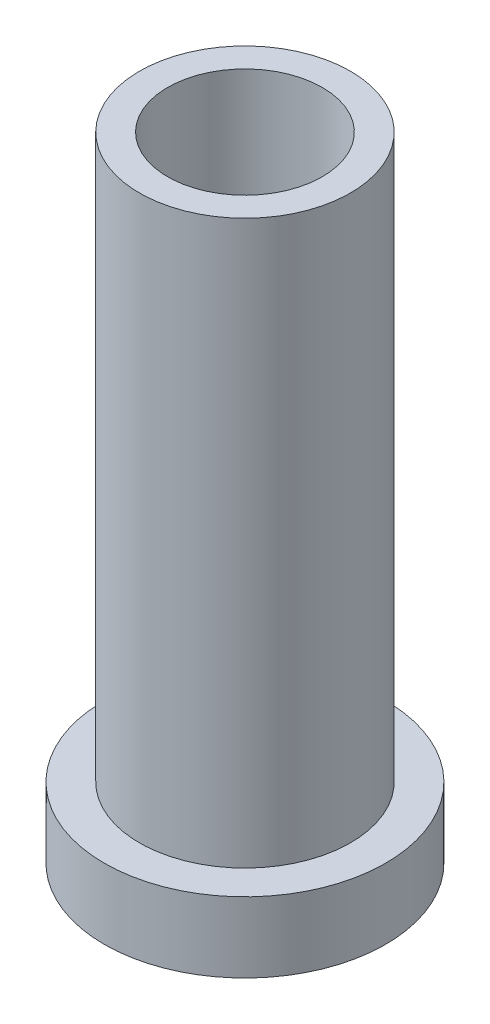
ISO-10303-21;
HEADER;
FILE_DESCRIPTION(('STEP AP214'),'2;1');
FILE_NAME('part.step','',(''),(''),'','','');
FILE_SCHEMA(('AUTOMOTIVE_DESIGN { 1 0 10303 214 1 1 1 1 }'));
ENDSEC;
DATA;
#1=APPLICATION_CONTEXT('core data for automotive mechanical design processes');
#2=APPLICATION_PROTOCOL_DEFINITION('international standard','automotive_design',2000,#1);
#3=PRODUCT_CONTEXT('',#1,'mechanical');
#4=PRODUCT('Part','Part','',(#3));
#5=PRODUCT_RELATED_PRODUCT_CATEGORY('part','',(#4));
#6=PRODUCT_DEFINITION_FORMATION('','',#4);
#7=PRODUCT_DEFINITION_CONTEXT('part definition',#1,'design');
#8=PRODUCT_DEFINITION('design','',#6,#7);
#9=PRODUCT_DEFINITION_SHAPE('','',#8);
#10=(LENGTH_UNIT() NAMED_UNIT(*) SI_UNIT(.MILLI.,.METRE.));
#11=(NAMED_UNIT(*) PLANE_ANGLE_UNIT() SI_UNIT($,.RADIAN.));
#12=(NAMED_UNIT(*) SI_UNIT($,.STERADIAN.) SOLID_ANGLE_UNIT());
#13=UNCERTAINTY_MEASURE_WITH_UNIT(LENGTH_MEASURE(1.E-05),#10,'distance_accuracy_value','');
#14=(GEOMETRIC_REPRESENTATION_CONTEXT(3) GLOBAL_UNCERTAINTY_ASSIGNED_CONTEXT((#13)) GLOBAL_UNIT_ASSIGNED_CONTEXT((#10,
#11,#12)) REPRESENTATION_CONTEXT('',''));
#15=CARTESIAN_POINT('',(0.,0.,0.));
#16=DIRECTION('',(0.,0.,1.));
#17=DIRECTION('',(1.,0.,0.));
#18=AXIS2_PLACEMENT_3D('',#15,#16,#17);
#19=CARTESIAN_POINT('',(0.,5.,0.));
#20=DIRECTION('',(0.,-1.,0.));
#21=DIRECTION('',(0.,0.,-1.));
#22=AXIS2_PLACEMENT_3D('',#19,#20,#21);
#23=CYLINDRICAL_SURFACE('',#22,10.);
#24=CARTESIAN_POINT('',(0.,5.,0.));
#25=DIRECTION('',(0.,1.,0.));
#26=DIRECTION('',(0.,0.,1.));
#27=AXIS2_PLACEMENT_3D('',#24,#25,#26);
#28=CIRCLE('',#27,10.);
#29=CARTESIAN_POINT('',(0.,5.,10.));
#30=VERTEX_POINT('',#29);
#31=EDGE_CURVE('E10',#30,#30,#28,.T.);
#32=ORIENTED_EDGE('',*,*,#31,.F.);
#33=EDGE_LOOP('',(#32));
#34=FACE_BOUND('',#33,.T.);
#35=CARTESIAN_POINT('',(0.,0.,0.));
#36=DIRECTION('',(0.,1.,0.));
#37=DIRECTION('',(0.,0.,1.));
#38=AXIS2_PLACEMENT_3D('',#35,#36,#37);
#39=CIRCLE('',#38,10.);
#40=CARTESIAN_POINT('',(0.,0.,10.));
#41=VERTEX_POINT('',#40);
#42=EDGE_CURVE('E38',#41,#41,#39,.T.);
#43=ORIENTED_EDGE('',*,*,#42,.T.);
#44=EDGE_LOOP('',(#43));
#45=FACE_BOUND('',#44,.T.);
#46=ADVANCED_FACE('F35',(#34,#45),#23,.T.);
#47=CARTESIAN_POINT('',(0.,5.,0.));
#48=DIRECTION('',(0.,1.,0.));
#49=DIRECTION('',(0.,0.,1.));
#50=AXIS2_PLACEMENT_3D('',#47,#48,#49);
#51=PLANE('',#50);
#52=CARTESIAN_POINT('',(0.,5.,0.));
#53=DIRECTION('',(0.,1.,0.));
#54=DIRECTION('',(0.,0.,1.));
#55=AXIS2_PLACEMENT_3D('',#52,#53,#54);
#56=CIRCLE('',#55,7.5);
#57=CARTESIAN_POINT('',(0.,5.,-7.5));
#58=VERTEX_POINT('',#57);
#59=EDGE_CURVE('E45',#58,#58,#56,.F.);
#60=ORIENTED_EDGE('',*,*,#59,.T.);
#61=EDGE_LOOP('',(#60));
#62=FACE_BOUND('',#61,.T.);
#63=ORIENTED_EDGE('',*,*,#31,.T.);
#64=EDGE_LOOP('',(#63));
#65=FACE_BOUND('',#64,.T.);
#66=ADVANCED_FACE('F76',(#62,#65),#51,.T.);
#67=CARTESIAN_POINT('',(0.,0.,0.));
#68=DIRECTION('',(0.,1.,0.));
#69=DIRECTION('',(0.,0.,1.));
#70=AXIS2_PLACEMENT_3D('',#67,#68,#69);
#71=PLANE('',#70);
#72=CARTESIAN_POINT('',(0.,0.,0.));
#73=DIRECTION('',(0.,1.,0.));
#74=DIRECTION('',(0.,0.,1.));
#75=AXIS2_PLACEMENT_3D('',#72,#73,#74);
#76=CIRCLE('',#75,5.5);
#77=CARTESIAN_POINT('',(0.,0.,-5.5));
#78=VERTEX_POINT('',#77);
#79=EDGE_CURVE('E53',#78,#78,#76,.T.);
#80=ORIENTED_EDGE('',*,*,#79,.T.);
#81=EDGE_LOOP('',(#80));
#82=FACE_BOUND('',#81,.T.);
#83=ORIENTED_EDGE('',*,*,#42,.F.);
#84=EDGE_LOOP('',(#83));
#85=FACE_BOUND('',#84,.T.);
#86=ADVANCED_FACE('F70',(#82,#85),#71,.F.);
#87=CARTESIAN_POINT('',(0.,45.,0.));
#88=DIRECTION('',(0.,-1.,0.));
#89=DIRECTION('',(0.,0.,-1.));
#90=AXIS2_PLACEMENT_3D('',#87,#88,#89);
#91=CYLINDRICAL_SURFACE('',#90,7.5);
#92=CARTESIAN_POINT('',(0.,45.,0.));
#93=DIRECTION('',(0.,1.,0.));
#94=DIRECTION('',(0.,0.,1.));
#95=AXIS2_PLACEMENT_3D('',#92,#93,#94);
#96=CIRCLE('',#95,7.5);
#97=CARTESIAN_POINT('',(0.,45.,-7.5));
#98=VERTEX_POINT('',#97);
#99=EDGE_CURVE('E49',#98,#98,#96,.T.);
#100=CARTESIAN_POINT('',(0.,5.,-7.5));
#101=CARTESIAN_POINT('',(0.,5.41666666666666,-7.5));
#102=CARTESIAN_POINT('',(0.,5.83333333333333,-7.5));
#103=CARTESIAN_POINT('',(0.,6.66666666666667,-7.5));
#104=CARTESIAN_POINT('',(0.,7.08333333333333,-7.5));
#105=CARTESIAN_POINT('',(0.,7.91666666666667,-7.5));
#106=CARTESIAN_POINT('',(0.,8.33333333333333,-7.5));
#107=CARTESIAN_POINT('',(0.,9.16666666666667,-7.5));
#108=CARTESIAN_POINT('',(0.,9.58333333333333,-7.5));
#109=CARTESIAN_POINT('',(0.,10.4166666666667,-7.5));
#110=CARTESIAN_POINT('',(0.,10.8333333333333,-7.5));
#111=CARTESIAN_POINT('',(0.,11.6666666666667,-7.5));
#112=CARTESIAN_POINT('',(0.,12.0833333333333,-7.5));
#113=CARTESIAN_POINT('',(0.,12.9166666666667,-7.5));
#114=CARTESIAN_POINT('',(0.,13.3333333333333,-7.5));
#115=CARTESIAN_POINT('',(0.,14.1666666666667,-7.5));
#116=CARTESIAN_POINT('',(0.,14.5833333333333,-7.5));
#117=CARTESIAN_POINT('',(0.,15.4166666666667,-7.5));
#118=CARTESIAN_POINT('',(0.,15.8333333333333,-7.5));
#119=CARTESIAN_POINT('',(0.,16.6666666666667,-7.5));
#120=CARTESIAN_POINT('',(0.,17.0833333333333,-7.5));
#121=CARTESIAN_POINT('',(0.,17.9166666666667,-7.5));
#122=CARTESIAN_POINT('',(0.,18.3333333333333,-7.5));
#123=CARTESIAN_POINT('',(0.,19.1666666666667,-7.5));
#124=CARTESIAN_POINT('',(0.,19.5833333333333,-7.5));
#125=CARTESIAN_POINT('',(0.,20.4166666666667,-7.5));
#126=CARTESIAN_POINT('',(0.,20.8333333333333,-7.5));
#127=CARTESIAN_POINT('',(0.,21.6666666666667,-7.5));
#128=CARTESIAN_POINT('',(0.,22.0833333333333,-7.5));
#129=CARTESIAN_POINT('',(0.,22.9166666666667,-7.5));
#130=CARTESIAN_POINT('',(0.,23.3333333333333,-7.5));
#131=CARTESIAN_POINT('',(0.,24.1666666666667,-7.5));
#132=CARTESIAN_POINT('',(0.,24.5833333333333,-7.5));
#133=CARTESIAN_POINT('',(0.,25.4166666666667,-7.5));
#134=CARTESIAN_POINT('',(0.,25.8333333333333,-7.5));
#135=CARTESIAN_POINT('',(0.,26.6666666666667,-7.5));
#136=CARTESIAN_POINT('',(0.,27.0833333333333,-7.5));
#137=CARTESIAN_POINT('',(0.,27.9166666666667,-7.5));
#138=CARTESIAN_POINT('',(0.,28.3333333333333,-7.5));
#139=CARTESIAN_POINT('',(0.,29.1666666666667,-7.5));
#140=CARTESIAN_POINT('',(0.,29.5833333333333,-7.5));
#141=CARTESIAN_POINT('',(0.,30.4166666666667,-7.5));
#142=CARTESIAN_POINT('',(0.,30.8333333333333,-7.5));
#143=CARTESIAN_POINT('',(0.,31.6666666666667,-7.5));
#144=CARTESIAN_POINT('',(0.,32.0833333333333,-7.5));
#145=CARTESIAN_POINT('',(0.,32.9166666666667,-7.5));
#146=CARTESIAN_POINT('',(0.,33.3333333333333,-7.5));
#147=CARTESIAN_POINT('',(0.,34.1666666666667,-7.5));
#148=CARTESIAN_POINT('',(0.,34.5833333333333,-7.5));
#149=CARTESIAN_POINT('',(0.,35.4166666666667,-7.5));
#150=CARTESIAN_POINT('',(0.,35.8333333333333,-7.5));
#151=CARTESIAN_POINT('',(0.,36.6666666666667,-7.5));
#152=CARTESIAN_POINT('',(0.,37.0833333333333,-7.5));
#153=CARTESIAN_POINT('',(0.,37.9166666666667,-7.5));
#154=CARTESIAN_POINT('',(0.,38.3333333333333,-7.5));
#155=CARTESIAN_POINT('',(0.,39.1666666666667,-7.5));
#156=CARTESIAN_POINT('',(0.,39.5833333333333,-7.5));
#157=CARTESIAN_POINT('',(0.,40.4166666666667,-7.5));
#158=CARTESIAN_POINT('',(0.,40.8333333333333,-7.5));
#159=CARTESIAN_POINT('',(0.,41.6666666666667,-7.5));
#160=CARTESIAN_POINT('',(0.,42.0833333333333,-7.5));
#161=CARTESIAN_POINT('',(0.,42.9166666666667,-7.5));
#162=CARTESIAN_POINT('',(0.,43.3333333333333,-7.5));
#163=CARTESIAN_POINT('',(0.,44.1666666666667,-7.5));
#164=CARTESIAN_POINT('',(0.,44.5833333333333,-7.5));
#165=CARTESIAN_POINT('',(0.,45.,-7.5));
#166=B_SPLINE_CURVE_WITH_KNOTS('',3,(#100,#101,#102,#103,#104,#105,#106,#107,#108,#109,#110,
#111,#112,#113,#114,#115,#116,#117,#118,#119,#120,#121,#122,#123,#124,#125,#126,#127,#128,#129,
#130,#131,#132,#133,#134,#135,#136,#137,#138,#139,#140,#141,#142,#143,#144,#145,#146,#147,#148,
#149,#150,#151,#152,#153,#154,#155,#156,#157,#158,#159,#160,#161,#162,#163,#164,#165),
.UNSPECIFIED.,.F.,.F.,(4,2,2,2,2,2,2,2,2,2,2,2,2,2,2,2,2,2,2,2,2,2,2,2,2,2,2,2,2,2,2,2,4),(0.,
1.25,2.5,3.75,5.,6.25,7.5,8.75,10.,11.25,12.5,13.75,15.,16.25,17.5,18.75,20.,21.25,22.5,23.75,
25.,26.25,27.5,28.75,30.,31.25,32.5,33.75,35.,36.25,37.5,38.75,40.),.UNSPECIFIED.);
#167=EDGE_CURVE('BSEAM65',#58,#98,#166,.T.);
#168=ORIENTED_EDGE('',*,*,#59,.F.);
#169=ORIENTED_EDGE('',*,*,#99,.F.);
#170=ORIENTED_EDGE('',*,*,#167,.T.);
#171=ORIENTED_EDGE('',*,*,#167,.F.);
#172=EDGE_LOOP('',(#168,#170,#169,#171));
#173=FACE_BOUND('',#172,.T.);
#174=ADVANCED_FACE('F65',(#173),#91,.T.);
#175=CARTESIAN_POINT('',(0.,45.,0.));
#176=DIRECTION('',(0.,1.,0.));
#177=DIRECTION('',(0.,0.,1.));
#178=AXIS2_PLACEMENT_3D('',#175,#176,#177);
#179=PLANE('',#178);
#180=CARTESIAN_POINT('',(0.,45.,0.));
#181=DIRECTION('',(0.,1.,0.));
#182=DIRECTION('',(0.,0.,1.));
#183=AXIS2_PLACEMENT_3D('',#180,#181,#182);
#184=CIRCLE('',#183,5.5);
#185=CARTESIAN_POINT('',(0.,45.,-5.5));
#186=VERTEX_POINT('',#185);
#187=EDGE_CURVE('E52',#186,#186,#184,.T.);
#188=ORIENTED_EDGE('',*,*,#187,.F.);
#189=EDGE_LOOP('',(#188));
#190=FACE_BOUND('',#189,.T.);
#191=ORIENTED_EDGE('',*,*,#99,.T.);
#192=EDGE_LOOP('',(#191));
#193=FACE_BOUND('',#192,.T.);
#194=ADVANCED_FACE('F62',(#190,#193),#179,.T.);
#195=CARTESIAN_POINT('',(0.,45.,0.));
#196=DIRECTION('',(0.,-1.,0.));
#197=DIRECTION('',(0.,0.,-1.));
#198=AXIS2_PLACEMENT_3D('',#195,#196,#197);
#199=CYLINDRICAL_SURFACE('',#198,5.5);
#200=CARTESIAN_POINT('',(0.,45.,-5.5));
#201=CARTESIAN_POINT('',(0.,44.53125,-5.5));
#202=CARTESIAN_POINT('',(0.,44.0625,-5.5));
#203=CARTESIAN_POINT('',(0.,43.125,-5.5));
#204=CARTESIAN_POINT('',(0.,42.65625,-5.5));
#205=CARTESIAN_POINT('',(0.,41.71875,-5.5));
#206=CARTESIAN_POINT('',(0.,41.25,-5.5));
#207=CARTESIAN_POINT('',(0.,40.3125,-5.5));
#208=CARTESIAN_POINT('',(0.,39.84375,-5.5));
#209=CARTESIAN_POINT('',(0.,38.90625,-5.5));
#210=CARTESIAN_POINT('',(0.,38.4375,-5.5));
#211=CARTESIAN_POINT('',(0.,37.5,-5.5));
#212=CARTESIAN_POINT('',(0.,37.03125,-5.5));
#213=CARTESIAN_POINT('',(0.,36.09375,-5.5));
#214=CARTESIAN_POINT('',(0.,35.625,-5.5));
#215=CARTESIAN_POINT('',(0.,34.6875,-5.5));
#216=CARTESIAN_POINT('',(0.,34.21875,-5.5));
#217=CARTESIAN_POINT('',(0.,33.28125,-5.5));
#218=CARTESIAN_POINT('',(0.,32.8125,-5.5));
#219=CARTESIAN_POINT('',(0.,31.875,-5.5));
#220=CARTESIAN_POINT('',(0.,31.40625,-5.5));
#221=CARTESIAN_POINT('',(0.,30.46875,-5.5));
#222=CARTESIAN_POINT('',(0.,30.,-5.5));
#223=CARTESIAN_POINT('',(0.,29.0625,-5.5));
#224=CARTESIAN_POINT('',(0.,28.59375,-5.5));
#225=CARTESIAN_POINT('',(0.,27.65625,-5.5));
#226=CARTESIAN_POINT('',(0.,27.1875,-5.5));
#227=CARTESIAN_POINT('',(0.,26.25,-5.5));
#228=CARTESIAN_POINT('',(0.,25.78125,-5.5));
#229=CARTESIAN_POINT('',(0.,24.84375,-5.5));
#230=CARTESIAN_POINT('',(0.,24.375,-5.5));
#231=CARTESIAN_POINT('',(0.,23.4375,-5.5));
#232=CARTESIAN_POINT('',(0.,22.96875,-5.5));
#233=CARTESIAN_POINT('',(0.,22.03125,-5.5));
#234=CARTESIAN_POINT('',(0.,21.5625,-5.5));
#235=CARTESIAN_POINT('',(0.,20.625,-5.5));
#236=CARTESIAN_POINT('',(0.,20.15625,-5.5));
#237=CARTESIAN_POINT('',(0.,19.21875,-5.5));
#238=CARTESIAN_POINT('',(0.,18.75,-5.5));
#239=CARTESIAN_POINT('',(0.,17.8125,-5.5));
#240=CARTESIAN_POINT('',(0.,17.34375,-5.5));
#241=CARTESIAN_POINT('',(0.,16.40625,-5.5));
#242=CARTESIAN_POINT('',(0.,15.9375,-5.5));
#243=CARTESIAN_POINT('',(0.,15.,-5.5));
#244=CARTESIAN_POINT('',(0.,14.53125,-5.5));
#245=CARTESIAN_POINT('',(0.,13.59375,-5.5));
#246=CARTESIAN_POINT('',(0.,13.125,-5.5));
#247=CARTESIAN_POINT('',(0.,12.1875,-5.5));
#248=CARTESIAN_POINT('',(0.,11.71875,-5.5));
#249=CARTESIAN_POINT('',(0.,10.78125,-5.5));
#250=CARTESIAN_POINT('',(0.,10.3125,-5.5));
#251=CARTESIAN_POINT('',(0.,9.375,-5.5));
#252=CARTESIAN_POINT('',(0.,8.90625,-5.5));
#253=CARTESIAN_POINT('',(0.,7.96874999999999,-5.5));
#254=CARTESIAN_POINT('',(0.,7.5,-5.5));
#255=CARTESIAN_POINT('',(0.,6.5625,-5.5));
#256=CARTESIAN_POINT('',(0.,6.09375,-5.5));
#257=CARTESIAN_POINT('',(0.,5.15625,-5.5));
#258=CARTESIAN_POINT('',(0.,4.68749999999999,-5.5));
#259=CARTESIAN_POINT('',(0.,3.74999999999999,-5.5));
#260=CARTESIAN_POINT('',(0.,3.28124999999999,-5.5));
#261=CARTESIAN_POINT('',(0.,2.34374999999999,-5.5));
#262=CARTESIAN_POINT('',(0.,1.87499999999999,-5.5));
#263=CARTESIAN_POINT('',(0.,0.937499999999992,-5.5));
#264=CARTESIAN_POINT('',(0.,0.468749999999993,-5.5));
#265=CARTESIAN_POINT('',(0.,0.,-5.5));
#266=B_SPLINE_CURVE_WITH_KNOTS('',3,(#200,#201,#202,#203,#204,#205,#206,#207,#208,#209,#210,
#211,#212,#213,#214,#215,#216,#217,#218,#219,#220,#221,#222,#223,#224,#225,#226,#227,#228,#229,
#230,#231,#232,#233,#234,#235,#236,#237,#238,#239,#240,#241,#242,#243,#244,#245,#246,#247,#248,
#249,#250,#251,#252,#253,#254,#255,#256,#257,#258,#259,#260,#261,#262,#263,#264,#265),
.UNSPECIFIED.,.F.,.F.,(4,2,2,2,2,2,2,2,2,2,2,2,2,2,2,2,2,2,2,2,2,2,2,2,2,2,2,2,2,2,2,2,4),(0.,
1.40625,2.8125,4.21875000000001,5.62500000000001,7.03125,8.4375,9.84375000000001,11.25,12.65625,
14.0625,15.46875,16.875,18.28125,19.6875,21.09375,22.5,23.90625,25.3125,26.71875,28.125,
29.53125,30.9375,32.34375,33.75,35.15625,36.5625,37.96875,39.375,40.78125,42.1875,43.59375,45.),.UNSPECIFIED.);
#267=EDGE_CURVE('BSEAM59',#186,#78,#266,.T.);
#268=ORIENTED_EDGE('',*,*,#187,.T.);
#269=ORIENTED_EDGE('',*,*,#79,.F.);
#270=ORIENTED_EDGE('',*,*,#267,.T.);
#271=ORIENTED_EDGE('',*,*,#267,.F.);
#272=EDGE_LOOP('',(#268,#270,#269,#271));
#273=FACE_BOUND('',#272,.T.);
#274=ADVANCED_FACE('F59',(#273),#199,.F.);
#275=CLOSED_SHELL('',(#46,#66,#86,#174,#194,#274));
#276=MANIFOLD_SOLID_BREP('B2',#275);
#277=ADVANCED_BREP_SHAPE_REPRESENTATION('',(#18,#276),#14);
#278=SHAPE_DEFINITION_REPRESENTATION(#9,#277);
ENDSEC;
END-ISO-10303-21;
